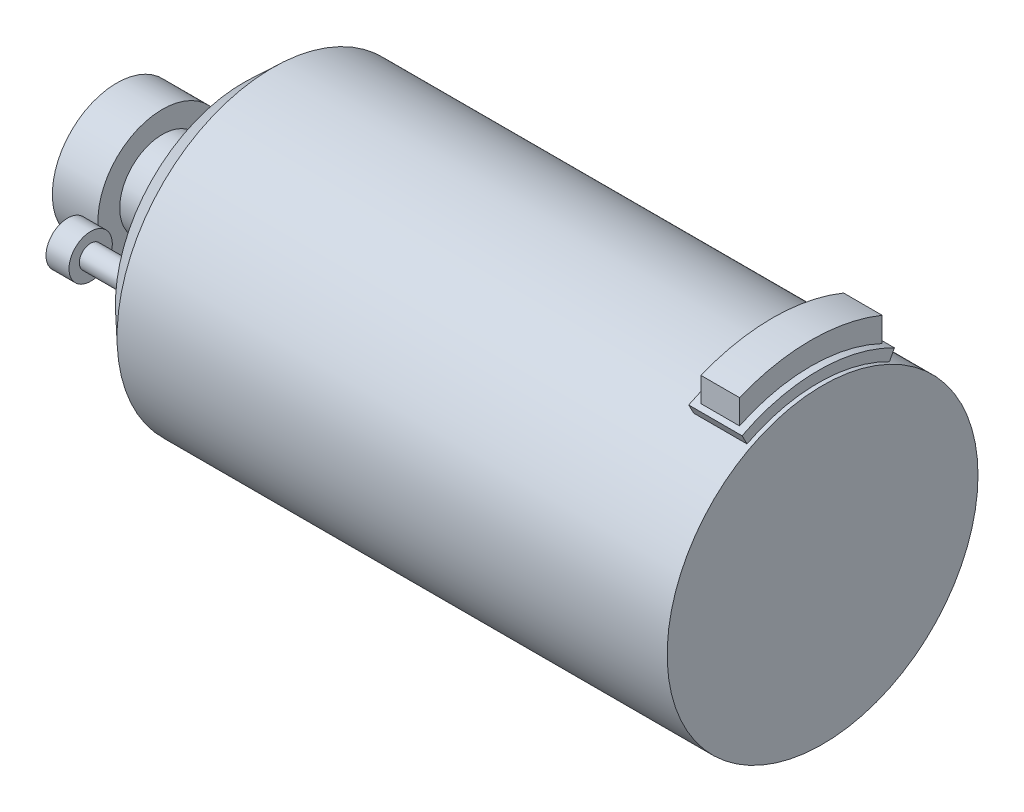
ISO-10303-21;
HEADER;
FILE_DESCRIPTION(('STEP AP214'),'2;1');
FILE_NAME('part.step','',(''),(''),'','','');
FILE_SCHEMA(('AUTOMOTIVE_DESIGN { 1 0 10303 214 1 1 1 1 }'));
ENDSEC;
DATA;
#1=APPLICATION_CONTEXT('core data for automotive mechanical design processes');
#2=APPLICATION_PROTOCOL_DEFINITION('international standard','automotive_design',2000,#1);
#3=PRODUCT_CONTEXT('',#1,'mechanical');
#4=PRODUCT('Part','Part','',(#3));
#5=PRODUCT_RELATED_PRODUCT_CATEGORY('part','',(#4));
#6=PRODUCT_DEFINITION_FORMATION('','',#4);
#7=PRODUCT_DEFINITION_CONTEXT('part definition',#1,'design');
#8=PRODUCT_DEFINITION('design','',#6,#7);
#9=PRODUCT_DEFINITION_SHAPE('','',#8);
#10=(LENGTH_UNIT() NAMED_UNIT(*) SI_UNIT(.MILLI.,.METRE.));
#11=(NAMED_UNIT(*) PLANE_ANGLE_UNIT() SI_UNIT($,.RADIAN.));
#12=(NAMED_UNIT(*) SI_UNIT($,.STERADIAN.) SOLID_ANGLE_UNIT());
#13=UNCERTAINTY_MEASURE_WITH_UNIT(LENGTH_MEASURE(1.E-05),#10,'distance_accuracy_value','');
#14=(GEOMETRIC_REPRESENTATION_CONTEXT(3) GLOBAL_UNCERTAINTY_ASSIGNED_CONTEXT((#13)) GLOBAL_UNIT_ASSIGNED_CONTEXT((#10,
#11,#12)) REPRESENTATION_CONTEXT('',''));
#15=CARTESIAN_POINT('',(0.,0.,0.));
#16=DIRECTION('',(0.,0.,1.));
#17=DIRECTION('',(1.,0.,0.));
#18=AXIS2_PLACEMENT_3D('',#15,#16,#17);
#19=CARTESIAN_POINT('',(94.6404,0.,0.));
#20=DIRECTION('',(1.,0.,0.));
#21=DIRECTION('',(0.,0.,-1.));
#22=AXIS2_PLACEMENT_3D('',#19,#20,#21);
#23=PLANE('',#22);
#24=CARTESIAN_POINT('',(94.6404,0.,0.));
#25=DIRECTION('',(1.,0.,0.));
#26=DIRECTION('',(0.,0.,-1.));
#27=AXIS2_PLACEMENT_3D('',#24,#25,#26);
#28=CIRCLE('',#27,19.9771);
#29=CARTESIAN_POINT('',(94.6404,0.,-19.9771));
#30=VERTEX_POINT('',#29);
#31=EDGE_CURVE('E185',#30,#30,#28,.T.);
#32=ORIENTED_EDGE('',*,*,#31,.T.);
#33=EDGE_LOOP('',(#32));
#34=FACE_BOUND('',#33,.T.);
#35=ADVANCED_FACE('F32',(#34),#23,.T.);
#36=CARTESIAN_POINT('',(94.6404,0.,0.));
#37=DIRECTION('',(1.,0.,0.));
#38=DIRECTION('',(0.,0.,-1.));
#39=AXIS2_PLACEMENT_3D('',#36,#37,#38);
#40=CYLINDRICAL_SURFACE('',#39,19.9771);
#41=CARTESIAN_POINT('',(94.0816,0.,0.));
#42=DIRECTION('',(1.,0.,0.));
#43=DIRECTION('',(0.,0.,-1.));
#44=AXIS2_PLACEMENT_3D('',#41,#42,#43);
#45=CIRCLE('',#44,19.9771);
#46=CARTESIAN_POINT('',(94.0816,17.7547439991048,9.15716058263971));
#47=VERTEX_POINT('',#46);
#48=CARTESIAN_POINT('',(94.0816,17.7547439991048,-9.15716058263971));
#49=VERTEX_POINT('',#48);
#50=EDGE_CURVE('E11',#47,#49,#45,.F.);
#51=ORIENTED_EDGE('',*,*,#50,.F.);
#52=DIRECTION('',(-1.,0.,0.));
#53=VECTOR('',#52,1.);
#54=CARTESIAN_POINT('',(94.0816,17.7547439991048,9.15716058263971));
#55=LINE('',#54,#53);
#56=CARTESIAN_POINT('',(87.2236,17.7547439991048,9.15716058263971));
#57=VERTEX_POINT('',#56);
#58=EDGE_CURVE('E140',#47,#57,#55,.T.);
#59=ORIENTED_EDGE('',*,*,#58,.T.);
#60=CARTESIAN_POINT('',(87.2236,0.,0.));
#61=DIRECTION('',(1.,0.,0.));
#62=DIRECTION('',(0.,0.,-1.));
#63=AXIS2_PLACEMENT_3D('',#60,#61,#62);
#64=CIRCLE('',#63,19.9771);
#65=CARTESIAN_POINT('',(87.2236,17.7547439991048,-9.15716058263971));
#66=VERTEX_POINT('',#65);
#67=EDGE_CURVE('E39',#57,#66,#64,.F.);
#68=ORIENTED_EDGE('',*,*,#67,.T.);
#69=DIRECTION('',(-1.,0.,0.));
#70=VECTOR('',#69,1.);
#71=CARTESIAN_POINT('',(94.0816,17.7547439991048,-9.15716058263971));
#72=LINE('',#71,#70);
#73=EDGE_CURVE('E153',#49,#66,#72,.T.);
#74=ORIENTED_EDGE('',*,*,#73,.F.);
#75=EDGE_LOOP('',(#51,#59,#68,#74));
#76=FACE_BOUND('',#75,.T.);
#77=ORIENTED_EDGE('',*,*,#31,.F.);
#78=EDGE_LOOP('',(#77));
#79=FACE_BOUND('',#78,.T.);
#80=CARTESIAN_POINT('',(23.9268,0.,0.));
#81=DIRECTION('',(1.,0.,0.));
#82=DIRECTION('',(0.,0.,-1.));
#83=AXIS2_PLACEMENT_3D('',#80,#81,#82);
#84=CIRCLE('',#83,19.9771);
#85=CARTESIAN_POINT('',(23.9268,0.,-19.9771));
#86=VERTEX_POINT('',#85);
#87=EDGE_CURVE('E182',#86,#86,#84,.T.);
#88=ORIENTED_EDGE('',*,*,#87,.T.);
#89=EDGE_LOOP('',(#88));
#90=FACE_BOUND('',#89,.T.);
#91=ADVANCED_FACE('F192',(#76,#79,#90),#40,.T.);
#92=CARTESIAN_POINT('',(23.9268,0.,0.));
#93=DIRECTION('',(1.,0.,0.));
#94=DIRECTION('',(0.,0.,-1.));
#95=AXIS2_PLACEMENT_3D('',#92,#93,#94);
#96=CONICAL_SURFACE('',#95,19.9771,0.756986000626544);
#97=CARTESIAN_POINT('',(20.1676,0.,0.));
#98=DIRECTION('',(1.,0.,0.));
#99=DIRECTION('',(0.,0.,-1.));
#100=AXIS2_PLACEMENT_3D('',#97,#98,#99);
#101=CIRCLE('',#100,16.4256668098212);
#102=CARTESIAN_POINT('',(20.1676,0.,-16.4256668098212));
#103=VERTEX_POINT('',#102);
#104=EDGE_CURVE('E179',#103,#103,#101,.T.);
#105=ORIENTED_EDGE('',*,*,#104,.T.);
#106=EDGE_LOOP('',(#105));
#107=FACE_BOUND('',#106,.T.);
#108=ORIENTED_EDGE('',*,*,#87,.F.);
#109=EDGE_LOOP('',(#108));
#110=FACE_BOUND('',#109,.T.);
#111=ADVANCED_FACE('F227',(#107,#110),#96,.T.);
#112=CARTESIAN_POINT('',(20.1676,16.4256668098212,0.));
#113=DIRECTION('',(-1.,0.,0.));
#114=DIRECTION('',(0.,0.,1.));
#115=AXIS2_PLACEMENT_3D('',#112,#113,#114);
#116=PLANE('',#115);
#117=CARTESIAN_POINT('',(20.1676,0.,12.7));
#118=DIRECTION('',(-1.,0.,0.));
#119=DIRECTION('',(0.,0.,1.));
#120=AXIS2_PLACEMENT_3D('',#117,#118,#119);
#121=CIRCLE('',#120,1.4605);
#122=CARTESIAN_POINT('',(20.1676,0.,14.1605));
#123=VERTEX_POINT('',#122);
#124=EDGE_CURVE('E438',#123,#123,#121,.T.);
#125=ORIENTED_EDGE('',*,*,#124,.F.);
#126=EDGE_LOOP('',(#125));
#127=FACE_BOUND('',#126,.T.);
#128=CARTESIAN_POINT('',(20.1676,0.,-12.7));
#129=DIRECTION('',(-1.,0.,0.));
#130=DIRECTION('',(0.,0.,1.));
#131=AXIS2_PLACEMENT_3D('',#128,#129,#130);
#132=CIRCLE('',#131,1.4605);
#133=CARTESIAN_POINT('',(20.1676,0.,-11.2395));
#134=VERTEX_POINT('',#133);
#135=EDGE_CURVE('E444',#134,#134,#132,.T.);
#136=ORIENTED_EDGE('',*,*,#135,.F.);
#137=EDGE_LOOP('',(#136));
#138=FACE_BOUND('',#137,.T.);
#139=CARTESIAN_POINT('',(20.1676,0.,0.));
#140=DIRECTION('',(1.,0.,0.));
#141=DIRECTION('',(0.,0.,-1.));
#142=AXIS2_PLACEMENT_3D('',#139,#140,#141);
#143=CIRCLE('',#142,2.5146);
#144=CARTESIAN_POINT('',(20.1676,0.,-2.5146));
#145=VERTEX_POINT('',#144);
#146=EDGE_CURVE('E176',#145,#145,#143,.T.);
#147=ORIENTED_EDGE('',*,*,#146,.T.);
#148=EDGE_LOOP('',(#147));
#149=FACE_BOUND('',#148,.T.);
#150=ORIENTED_EDGE('',*,*,#104,.F.);
#151=EDGE_LOOP('',(#150));
#152=FACE_BOUND('',#151,.T.);
#153=ADVANCED_FACE('F233',(#127,#138,#149,#152),#116,.T.);
#154=CARTESIAN_POINT('',(94.6404,0.,0.));
#155=DIRECTION('',(1.,0.,0.));
#156=DIRECTION('',(0.,0.,-1.));
#157=AXIS2_PLACEMENT_3D('',#154,#155,#156);
#158=CYLINDRICAL_SURFACE('',#157,2.5146);
#159=CARTESIAN_POINT('',(17.907,0.,0.));
#160=DIRECTION('',(1.,0.,0.));
#161=DIRECTION('',(0.,0.,-1.));
#162=AXIS2_PLACEMENT_3D('',#159,#160,#161);
#163=CIRCLE('',#162,2.5146);
#164=CARTESIAN_POINT('',(17.907,0.,-2.5146));
#165=VERTEX_POINT('',#164);
#166=EDGE_CURVE('E173',#165,#165,#163,.T.);
#167=ORIENTED_EDGE('',*,*,#166,.T.);
#168=EDGE_LOOP('',(#167));
#169=FACE_BOUND('',#168,.T.);
#170=ORIENTED_EDGE('',*,*,#146,.F.);
#171=EDGE_LOOP('',(#170));
#172=FACE_BOUND('',#171,.T.);
#173=ADVANCED_FACE('F239',(#169,#172),#158,.T.);
#174=CARTESIAN_POINT('',(17.907,2.5146,0.));
#175=DIRECTION('',(1.,0.,0.));
#176=DIRECTION('',(0.,0.,-1.));
#177=AXIS2_PLACEMENT_3D('',#174,#175,#176);
#178=PLANE('',#177);
#179=CARTESIAN_POINT('',(17.907,0.,0.));
#180=DIRECTION('',(1.,0.,0.));
#181=DIRECTION('',(0.,0.,-1.));
#182=AXIS2_PLACEMENT_3D('',#179,#180,#181);
#183=CIRCLE('',#182,5.4864);
#184=CARTESIAN_POINT('',(17.907,0.,-5.4864));
#185=VERTEX_POINT('',#184);
#186=EDGE_CURVE('E170',#185,#185,#183,.T.);
#187=ORIENTED_EDGE('',*,*,#186,.T.);
#188=EDGE_LOOP('',(#187));
#189=FACE_BOUND('',#188,.T.);
#190=ORIENTED_EDGE('',*,*,#166,.F.);
#191=EDGE_LOOP('',(#190));
#192=FACE_BOUND('',#191,.T.);
#193=ADVANCED_FACE('F245',(#189,#192),#178,.T.);
#194=CARTESIAN_POINT('',(94.6404,0.,0.));
#195=DIRECTION('',(1.,0.,0.));
#196=DIRECTION('',(0.,0.,-1.));
#197=AXIS2_PLACEMENT_3D('',#194,#195,#196);
#198=CYLINDRICAL_SURFACE('',#197,5.4864);
#199=CARTESIAN_POINT('',(9.779,0.,0.));
#200=DIRECTION('',(1.,0.,0.));
#201=DIRECTION('',(0.,0.,-1.));
#202=AXIS2_PLACEMENT_3D('',#199,#200,#201);
#203=CIRCLE('',#202,5.4864);
#204=CARTESIAN_POINT('',(9.779,0.,-5.4864));
#205=VERTEX_POINT('',#204);
#206=EDGE_CURVE('E167',#205,#205,#203,.T.);
#207=ORIENTED_EDGE('',*,*,#206,.T.);
#208=EDGE_LOOP('',(#207));
#209=FACE_BOUND('',#208,.T.);
#210=ORIENTED_EDGE('',*,*,#186,.F.);
#211=EDGE_LOOP('',(#210));
#212=FACE_BOUND('',#211,.T.);
#213=ADVANCED_FACE('F249',(#209,#212),#198,.T.);
#214=CARTESIAN_POINT('',(9.779,5.4864,0.));
#215=DIRECTION('',(1.,0.,0.));
#216=DIRECTION('',(0.,0.,-1.));
#217=AXIS2_PLACEMENT_3D('',#214,#215,#216);
#218=PLANE('',#217);
#219=CARTESIAN_POINT('',(9.779,0.,0.));
#220=DIRECTION('',(1.,0.,0.));
#221=DIRECTION('',(0.,0.,-1.));
#222=AXIS2_PLACEMENT_3D('',#219,#220,#221);
#223=CIRCLE('',#222,8.2804);
#224=CARTESIAN_POINT('',(9.779,0.,-8.2804));
#225=VERTEX_POINT('',#224);
#226=EDGE_CURVE('E164',#225,#225,#223,.T.);
#227=ORIENTED_EDGE('',*,*,#226,.T.);
#228=EDGE_LOOP('',(#227));
#229=FACE_BOUND('',#228,.T.);
#230=ORIENTED_EDGE('',*,*,#206,.F.);
#231=EDGE_LOOP('',(#230));
#232=FACE_BOUND('',#231,.T.);
#233=ADVANCED_FACE('F253',(#229,#232),#218,.T.);
#234=CARTESIAN_POINT('',(94.6404,0.,0.));
#235=DIRECTION('',(1.,0.,0.));
#236=DIRECTION('',(0.,0.,-1.));
#237=AXIS2_PLACEMENT_3D('',#234,#235,#236);
#238=CYLINDRICAL_SURFACE('',#237,8.2804);
#239=CARTESIAN_POINT('',(3.9116,0.,0.));
#240=DIRECTION('',(1.,0.,0.));
#241=DIRECTION('',(0.,0.,-1.));
#242=AXIS2_PLACEMENT_3D('',#239,#240,#241);
#243=CIRCLE('',#242,8.2804);
#244=CARTESIAN_POINT('',(3.9116,0.,-8.2804));
#245=VERTEX_POINT('',#244);
#246=EDGE_CURVE('E161',#245,#245,#243,.T.);
#247=ORIENTED_EDGE('',*,*,#246,.T.);
#248=EDGE_LOOP('',(#247));
#249=FACE_BOUND('',#248,.T.);
#250=ORIENTED_EDGE('',*,*,#226,.F.);
#251=EDGE_LOOP('',(#250));
#252=FACE_BOUND('',#251,.T.);
#253=ADVANCED_FACE('F257',(#249,#252),#238,.T.);
#254=CARTESIAN_POINT('',(3.9116,8.2804,0.));
#255=DIRECTION('',(-1.,0.,0.));
#256=DIRECTION('',(0.,0.,1.));
#257=AXIS2_PLACEMENT_3D('',#254,#255,#256);
#258=PLANE('',#257);
#259=CARTESIAN_POINT('',(3.9116,0.,0.));
#260=DIRECTION('',(1.,0.,0.));
#261=DIRECTION('',(0.,0.,-1.));
#262=AXIS2_PLACEMENT_3D('',#259,#260,#261);
#263=CIRCLE('',#262,2.5146);
#264=CARTESIAN_POINT('',(3.9116,0.,-2.5146));
#265=VERTEX_POINT('',#264);
#266=EDGE_CURVE('E158',#265,#265,#263,.T.);
#267=ORIENTED_EDGE('',*,*,#266,.T.);
#268=EDGE_LOOP('',(#267));
#269=FACE_BOUND('',#268,.T.);
#270=ORIENTED_EDGE('',*,*,#246,.F.);
#271=EDGE_LOOP('',(#270));
#272=FACE_BOUND('',#271,.T.);
#273=ADVANCED_FACE('F261',(#269,#272),#258,.T.);
#274=CARTESIAN_POINT('',(94.6404,0.,0.));
#275=DIRECTION('',(1.,0.,0.));
#276=DIRECTION('',(0.,0.,-1.));
#277=AXIS2_PLACEMENT_3D('',#274,#275,#276);
#278=CYLINDRICAL_SURFACE('',#277,2.5146);
#279=CARTESIAN_POINT('',(0.,0.,0.));
#280=DIRECTION('',(1.,0.,0.));
#281=DIRECTION('',(0.,0.,-1.));
#282=AXIS2_PLACEMENT_3D('',#279,#280,#281);
#283=CIRCLE('',#282,2.5146);
#284=CARTESIAN_POINT('',(0.,0.,-2.5146));
#285=VERTEX_POINT('',#284);
#286=EDGE_CURVE('E155',#285,#285,#283,.T.);
#287=ORIENTED_EDGE('',*,*,#286,.T.);
#288=EDGE_LOOP('',(#287));
#289=FACE_BOUND('',#288,.T.);
#290=ORIENTED_EDGE('',*,*,#266,.F.);
#291=EDGE_LOOP('',(#290));
#292=FACE_BOUND('',#291,.T.);
#293=ADVANCED_FACE('F265',(#289,#292),#278,.T.);
#294=CARTESIAN_POINT('',(0.,2.5146,0.));
#295=DIRECTION('',(-1.,0.,0.));
#296=DIRECTION('',(0.,0.,1.));
#297=AXIS2_PLACEMENT_3D('',#294,#295,#296);
#298=PLANE('',#297);
#299=ORIENTED_EDGE('',*,*,#286,.F.);
#300=EDGE_LOOP('',(#299));
#301=FACE_BOUND('',#300,.T.);
#302=ADVANCED_FACE('F269',(#301),#298,.T.);
#303=CARTESIAN_POINT('',(94.0816,18.985047302285,-9.7917));
#304=DIRECTION('',(0.,0.458382877526754,0.888754824228984));
#305=DIRECTION('',(0.,-0.888754824228984,0.458382877526754));
#306=AXIS2_PLACEMENT_3D('',#303,#304,#305);
#307=PLANE('',#306);
#308=ORIENTED_EDGE('',*,*,#73,.T.);
#309=DIRECTION('',(0.,0.888754824228984,-0.458382877526754));
#310=VECTOR('',#309,1.);
#311=CARTESIAN_POINT('',(87.2236,18.985047302285,-9.7917));
#312=LINE('',#311,#310);
#313=CARTESIAN_POINT('',(87.2236,18.985047302285,-9.7917));
#314=VERTEX_POINT('',#313);
#315=EDGE_CURVE('E132',#66,#314,#312,.T.);
#316=ORIENTED_EDGE('',*,*,#315,.T.);
#317=DIRECTION('',(-1.,0.,0.));
#318=VECTOR('',#317,1.);
#319=CARTESIAN_POINT('',(94.0816,18.985047302285,-9.7917));
#320=LINE('',#319,#318);
#321=CARTESIAN_POINT('',(94.0816,18.985047302285,-9.7917));
#322=VERTEX_POINT('',#321);
#323=EDGE_CURVE('E151',#322,#314,#320,.T.);
#324=ORIENTED_EDGE('',*,*,#323,.F.);
#325=DIRECTION('',(0.,0.888754824228984,-0.458382877526754));
#326=VECTOR('',#325,1.);
#327=CARTESIAN_POINT('',(94.0816,18.985047302285,-9.7917));
#328=LINE('',#327,#326);
#329=EDGE_CURVE('E133',#49,#322,#328,.T.);
#330=ORIENTED_EDGE('',*,*,#329,.F.);
#331=EDGE_LOOP('',(#308,#316,#324,#330));
#332=FACE_BOUND('',#331,.T.);
#333=ADVANCED_FACE('F210',(#332),#307,.F.);
#334=CARTESIAN_POINT('',(94.0816,0.,0.));
#335=DIRECTION('',(-1.,0.,0.));
#336=DIRECTION('',(0.,0.,1.));
#337=AXIS2_PLACEMENT_3D('',#334,#335,#336);
#338=CYLINDRICAL_SURFACE('',#337,21.3614);
#339=DIRECTION('',(-1.,0.,0.));
#340=VECTOR('',#339,1.);
#341=CARTESIAN_POINT('',(93.1291,19.2933022989845,-9.16939999999998));
#342=LINE('',#341,#340);
#343=CARTESIAN_POINT('',(93.1291,19.2933022989845,-9.16939999999998));
#344=VERTEX_POINT('',#343);
#345=CARTESIAN_POINT('',(88.1761,19.2933022989845,-9.16939999999998));
#346=VERTEX_POINT('',#345);
#347=EDGE_CURVE('E46',#344,#346,#342,.T.);
#348=ORIENTED_EDGE('',*,*,#347,.F.);
#349=CARTESIAN_POINT('',(93.1291,0.,0.));
#350=DIRECTION('',(1.,0.,0.));
#351=DIRECTION('',(0.,0.,-1.));
#352=AXIS2_PLACEMENT_3D('',#349,#350,#351);
#353=CIRCLE('',#352,21.3614);
#354=CARTESIAN_POINT('',(93.1291,19.2933022989845,9.16940000000001));
#355=VERTEX_POINT('',#354);
#356=EDGE_CURVE('E50',#344,#355,#353,.T.);
#357=ORIENTED_EDGE('',*,*,#356,.T.);
#358=DIRECTION('',(-1.,0.,0.));
#359=VECTOR('',#358,1.);
#360=CARTESIAN_POINT('',(93.1291,19.2933022989845,9.16940000000002));
#361=LINE('',#360,#359);
#362=CARTESIAN_POINT('',(88.1761,19.2933022989845,9.16940000000002));
#363=VERTEX_POINT('',#362);
#364=EDGE_CURVE('E115',#355,#363,#361,.T.);
#365=ORIENTED_EDGE('',*,*,#364,.T.);
#366=CARTESIAN_POINT('',(88.1761,0.,0.));
#367=DIRECTION('',(1.,0.,0.));
#368=DIRECTION('',(0.,0.,-1.));
#369=AXIS2_PLACEMENT_3D('',#366,#367,#368);
#370=CIRCLE('',#369,21.3614);
#371=EDGE_CURVE('E128',#346,#363,#370,.T.);
#372=ORIENTED_EDGE('',*,*,#371,.F.);
#373=EDGE_LOOP('',(#348,#357,#365,#372));
#374=FACE_BOUND('',#373,.T.);
#375=ORIENTED_EDGE('',*,*,#323,.T.);
#376=CARTESIAN_POINT('',(87.2236,0.,0.));
#377=DIRECTION('',(1.,0.,0.));
#378=DIRECTION('',(0.,0.,-1.));
#379=AXIS2_PLACEMENT_3D('',#376,#377,#378);
#380=CIRCLE('',#379,21.3614);
#381=CARTESIAN_POINT('',(87.2236,18.985047302285,9.7917));
#382=VERTEX_POINT('',#381);
#383=EDGE_CURVE('E143',#314,#382,#380,.T.);
#384=ORIENTED_EDGE('',*,*,#383,.T.);
#385=DIRECTION('',(-1.,0.,0.));
#386=VECTOR('',#385,1.);
#387=CARTESIAN_POINT('',(94.0816,18.985047302285,9.7917));
#388=LINE('',#387,#386);
#389=CARTESIAN_POINT('',(94.0816,18.985047302285,9.7917));
#390=VERTEX_POINT('',#389);
#391=EDGE_CURVE('E149',#390,#382,#388,.T.);
#392=ORIENTED_EDGE('',*,*,#391,.F.);
#393=CARTESIAN_POINT('',(94.0816,0.,0.));
#394=DIRECTION('',(1.,0.,0.));
#395=DIRECTION('',(0.,0.,-1.));
#396=AXIS2_PLACEMENT_3D('',#393,#394,#395);
#397=CIRCLE('',#396,21.3614);
#398=EDGE_CURVE('E135',#322,#390,#397,.T.);
#399=ORIENTED_EDGE('',*,*,#398,.F.);
#400=EDGE_LOOP('',(#375,#384,#392,#399));
#401=FACE_BOUND('',#400,.T.);
#402=ADVANCED_FACE('F206',(#374,#401),#338,.T.);
#403=CARTESIAN_POINT('',(94.0816,18.985047302285,9.7917));
#404=DIRECTION('',(0.,0.458382877526754,-0.888754824228984));
#405=DIRECTION('',(0.,0.888754824228984,0.458382877526754));
#406=AXIS2_PLACEMENT_3D('',#403,#404,#405);
#407=PLANE('',#406);
#408=ORIENTED_EDGE('',*,*,#391,.T.);
#409=DIRECTION('',(0.,-0.888754824228984,-0.458382877526754));
#410=VECTOR('',#409,1.);
#411=CARTESIAN_POINT('',(87.2236,18.985047302285,9.7917));
#412=LINE('',#411,#410);
#413=EDGE_CURVE('E136',#382,#57,#412,.T.);
#414=ORIENTED_EDGE('',*,*,#413,.T.);
#415=ORIENTED_EDGE('',*,*,#58,.F.);
#416=DIRECTION('',(0.,-0.888754824228984,-0.458382877526754));
#417=VECTOR('',#416,1.);
#418=CARTESIAN_POINT('',(94.0816,18.985047302285,9.7917));
#419=LINE('',#418,#417);
#420=EDGE_CURVE('E138',#390,#47,#419,.T.);
#421=ORIENTED_EDGE('',*,*,#420,.F.);
#422=EDGE_LOOP('',(#408,#414,#415,#421));
#423=FACE_BOUND('',#422,.T.);
#424=ADVANCED_FACE('F201',(#423),#407,.F.);
#425=CARTESIAN_POINT('',(94.0816,0.,0.));
#426=DIRECTION('',(1.,0.,0.));
#427=DIRECTION('',(0.,0.,-1.));
#428=AXIS2_PLACEMENT_3D('',#425,#426,#427);
#429=PLANE('',#428);
#430=ORIENTED_EDGE('',*,*,#420,.T.);
#431=ORIENTED_EDGE('',*,*,#50,.T.);
#432=ORIENTED_EDGE('',*,*,#329,.T.);
#433=ORIENTED_EDGE('',*,*,#398,.T.);
#434=EDGE_LOOP('',(#430,#431,#432,#433));
#435=FACE_BOUND('',#434,.T.);
#436=ADVANCED_FACE('F212',(#435),#429,.T.);
#437=CARTESIAN_POINT('',(87.2236,0.,0.));
#438=DIRECTION('',(1.,0.,0.));
#439=DIRECTION('',(0.,0.,-1.));
#440=AXIS2_PLACEMENT_3D('',#437,#438,#439);
#441=PLANE('',#440);
#442=ORIENTED_EDGE('',*,*,#67,.F.);
#443=ORIENTED_EDGE('',*,*,#413,.F.);
#444=ORIENTED_EDGE('',*,*,#383,.F.);
#445=ORIENTED_EDGE('',*,*,#315,.F.);
#446=EDGE_LOOP('',(#442,#443,#444,#445));
#447=FACE_BOUND('',#446,.T.);
#448=ADVANCED_FACE('F198',(#447),#441,.F.);
#449=CARTESIAN_POINT('',(93.1291,0.,0.));
#450=DIRECTION('',(1.,0.,0.));
#451=DIRECTION('',(0.,0.,-1.));
#452=AXIS2_PLACEMENT_3D('',#449,#450,#451);
#453=PLANE('',#452);
#454=ORIENTED_EDGE('',*,*,#356,.F.);
#455=DIRECTION('',(0.,1.,0.));
#456=VECTOR('',#455,1.);
#457=CARTESIAN_POINT('',(93.1291,19.2933022989845,-9.16939999999998));
#458=LINE('',#457,#456);
#459=CARTESIAN_POINT('',(93.1291,22.4429022989845,-9.16939999999998));
#460=VERTEX_POINT('',#459);
#461=EDGE_CURVE('E92',#344,#460,#458,.T.);
#462=ORIENTED_EDGE('',*,*,#461,.T.);
#463=CARTESIAN_POINT('',(93.1291,0.,0.));
#464=DIRECTION('',(1.,0.,0.));
#465=DIRECTION('',(0.,0.,1.));
#466=AXIS2_PLACEMENT_3D('',#463,#464,#465);
#467=CIRCLE('',#466,24.2437983814782);
#468=CARTESIAN_POINT('',(93.1291,22.4429022989845,9.16940000000002));
#469=VERTEX_POINT('',#468);
#470=EDGE_CURVE('E96',#460,#469,#467,.T.);
#471=ORIENTED_EDGE('',*,*,#470,.T.);
#472=DIRECTION('',(0.,-1.,0.));
#473=VECTOR('',#472,1.);
#474=CARTESIAN_POINT('',(93.1291,19.2933022989845,9.16940000000002));
#475=LINE('',#474,#473);
#476=EDGE_CURVE('E113',#469,#355,#475,.T.);
#477=ORIENTED_EDGE('',*,*,#476,.T.);
#478=EDGE_LOOP('',(#454,#462,#471,#477));
#479=FACE_BOUND('',#478,.T.);
#480=ADVANCED_FACE('F94',(#479),#453,.T.);
#481=CARTESIAN_POINT('',(88.1761,0.,0.));
#482=DIRECTION('',(1.,0.,0.));
#483=DIRECTION('',(0.,0.,-1.));
#484=AXIS2_PLACEMENT_3D('',#481,#482,#483);
#485=PLANE('',#484);
#486=DIRECTION('',(0.,1.,0.));
#487=VECTOR('',#486,1.);
#488=CARTESIAN_POINT('',(88.1761,19.2933022989845,-9.16939999999998));
#489=LINE('',#488,#487);
#490=CARTESIAN_POINT('',(88.1761,22.4429022989845,-9.16939999999998));
#491=VERTEX_POINT('',#490);
#492=EDGE_CURVE('E105',#346,#491,#489,.T.);
#493=ORIENTED_EDGE('',*,*,#492,.F.);
#494=ORIENTED_EDGE('',*,*,#371,.T.);
#495=DIRECTION('',(0.,-1.,0.));
#496=VECTOR('',#495,1.);
#497=CARTESIAN_POINT('',(88.1761,19.2933022989845,9.16940000000002));
#498=LINE('',#497,#496);
#499=CARTESIAN_POINT('',(88.1761,22.4429022989845,9.16940000000002));
#500=VERTEX_POINT('',#499);
#501=EDGE_CURVE('E99',#500,#363,#498,.T.);
#502=ORIENTED_EDGE('',*,*,#501,.F.);
#503=CARTESIAN_POINT('',(88.1761,0.,0.));
#504=DIRECTION('',(1.,0.,0.));
#505=DIRECTION('',(0.,0.,1.));
#506=AXIS2_PLACEMENT_3D('',#503,#504,#505);
#507=CIRCLE('',#506,24.2437983814782);
#508=EDGE_CURVE('E120',#491,#500,#507,.T.);
#509=ORIENTED_EDGE('',*,*,#508,.F.);
#510=EDGE_LOOP('',(#493,#494,#502,#509));
#511=FACE_BOUND('',#510,.T.);
#512=ADVANCED_FACE('F295',(#511),#485,.F.);
#513=CARTESIAN_POINT('',(93.1291,19.2933022989845,-9.16939999999998));
#514=DIRECTION('',(0.,0.,1.));
#515=DIRECTION('',(1.,0.,0.));
#516=AXIS2_PLACEMENT_3D('',#513,#514,#515);
#517=PLANE('',#516);
#518=ORIENTED_EDGE('',*,*,#492,.T.);
#519=DIRECTION('',(-1.,0.,0.));
#520=VECTOR('',#519,1.);
#521=CARTESIAN_POINT('',(93.1291,22.4429022989845,-9.16939999999998));
#522=LINE('',#521,#520);
#523=EDGE_CURVE('E102',#460,#491,#522,.T.);
#524=ORIENTED_EDGE('',*,*,#523,.F.);
#525=ORIENTED_EDGE('',*,*,#461,.F.);
#526=ORIENTED_EDGE('',*,*,#347,.T.);
#527=EDGE_LOOP('',(#518,#524,#525,#526));
#528=FACE_BOUND('',#527,.T.);
#529=ADVANCED_FACE('F103',(#528),#517,.F.);
#530=CARTESIAN_POINT('',(93.1291,0.,0.));
#531=DIRECTION('',(-1.,0.,0.));
#532=DIRECTION('',(0.,0.,1.));
#533=AXIS2_PLACEMENT_3D('',#530,#531,#532);
#534=CYLINDRICAL_SURFACE('',#533,24.2437983814782);
#535=ORIENTED_EDGE('',*,*,#508,.T.);
#536=DIRECTION('',(-1.,0.,0.));
#537=VECTOR('',#536,1.);
#538=CARTESIAN_POINT('',(93.1291,22.4429022989845,9.16940000000002));
#539=LINE('',#538,#537);
#540=EDGE_CURVE('E108',#469,#500,#539,.T.);
#541=ORIENTED_EDGE('',*,*,#540,.F.);
#542=ORIENTED_EDGE('',*,*,#470,.F.);
#543=ORIENTED_EDGE('',*,*,#523,.T.);
#544=EDGE_LOOP('',(#535,#541,#542,#543));
#545=FACE_BOUND('',#544,.T.);
#546=ADVANCED_FACE('F110',(#545),#534,.T.);
#547=CARTESIAN_POINT('',(93.1291,19.2933022989845,9.16940000000002));
#548=DIRECTION('',(0.,0.,-1.));
#549=DIRECTION('',(-1.,0.,0.));
#550=AXIS2_PLACEMENT_3D('',#547,#548,#549);
#551=PLANE('',#550);
#552=ORIENTED_EDGE('',*,*,#501,.T.);
#553=ORIENTED_EDGE('',*,*,#364,.F.);
#554=ORIENTED_EDGE('',*,*,#476,.F.);
#555=ORIENTED_EDGE('',*,*,#540,.T.);
#556=EDGE_LOOP('',(#552,#553,#554,#555));
#557=FACE_BOUND('',#556,.T.);
#558=ADVANCED_FACE('F321',(#557),#551,.F.);
#559=CARTESIAN_POINT('',(13.2588,0.,-12.7));
#560=DIRECTION('',(1.,0.,0.));
#561=DIRECTION('',(0.,0.,-1.));
#562=AXIS2_PLACEMENT_3D('',#559,#560,#561);
#563=CYLINDRICAL_SURFACE('',#562,1.4605);
#564=CARTESIAN_POINT('',(13.2588,0.,-12.7));
#565=DIRECTION('',(-1.,0.,0.));
#566=DIRECTION('',(0.,0.,1.));
#567=AXIS2_PLACEMENT_3D('',#564,#565,#566);
#568=CIRCLE('',#567,1.4605);
#569=CARTESIAN_POINT('',(13.2588,0.,-11.2395));
#570=VERTEX_POINT('',#569);
#571=EDGE_CURVE('E121',#570,#570,#568,.T.);
#572=ORIENTED_EDGE('',*,*,#571,.F.);
#573=EDGE_LOOP('',(#572));
#574=FACE_BOUND('',#573,.T.);
#575=ORIENTED_EDGE('',*,*,#135,.T.);
#576=EDGE_LOOP('',(#575));
#577=FACE_BOUND('',#576,.T.);
#578=ADVANCED_FACE('F330',(#574,#577),#563,.T.);
#579=CARTESIAN_POINT('',(13.2588,0.,12.7));
#580=DIRECTION('',(1.,0.,0.));
#581=DIRECTION('',(0.,0.,-1.));
#582=AXIS2_PLACEMENT_3D('',#579,#580,#581);
#583=CYLINDRICAL_SURFACE('',#582,1.4605);
#584=CARTESIAN_POINT('',(13.2588,0.,12.7));
#585=DIRECTION('',(-1.,0.,0.));
#586=DIRECTION('',(0.,0.,1.));
#587=AXIS2_PLACEMENT_3D('',#584,#585,#586);
#588=CIRCLE('',#587,1.4605);
#589=CARTESIAN_POINT('',(13.2588,0.,14.1605));
#590=VERTEX_POINT('',#589);
#591=EDGE_CURVE('E441',#590,#590,#588,.T.);
#592=ORIENTED_EDGE('',*,*,#591,.F.);
#593=EDGE_LOOP('',(#592));
#594=FACE_BOUND('',#593,.T.);
#595=ORIENTED_EDGE('',*,*,#124,.T.);
#596=EDGE_LOOP('',(#595));
#597=FACE_BOUND('',#596,.T.);
#598=ADVANCED_FACE('F348',(#594,#597),#583,.T.);
#599=CARTESIAN_POINT('',(10.2997,0.,12.7));
#600=DIRECTION('',(1.,0.,0.));
#601=DIRECTION('',(0.,0.,-1.));
#602=AXIS2_PLACEMENT_3D('',#599,#600,#601);
#603=CYLINDRICAL_SURFACE('',#602,2.7813);
#604=CARTESIAN_POINT('',(10.2997,0.,12.7));
#605=DIRECTION('',(-1.,0.,0.));
#606=DIRECTION('',(0.,0.,1.));
#607=AXIS2_PLACEMENT_3D('',#604,#605,#606);
#608=CIRCLE('',#607,2.7813);
#609=CARTESIAN_POINT('',(10.2997,0.,15.4813));
#610=VERTEX_POINT('',#609);
#611=EDGE_CURVE('E435',#610,#610,#608,.T.);
#612=ORIENTED_EDGE('',*,*,#611,.F.);
#613=EDGE_LOOP('',(#612));
#614=FACE_BOUND('',#613,.T.);
#615=CARTESIAN_POINT('',(13.2588,0.,12.7));
#616=DIRECTION('',(-1.,0.,0.));
#617=DIRECTION('',(0.,0.,1.));
#618=AXIS2_PLACEMENT_3D('',#615,#616,#617);
#619=CIRCLE('',#618,2.7813);
#620=CARTESIAN_POINT('',(13.2588,0.,15.4813));
#621=VERTEX_POINT('',#620);
#622=EDGE_CURVE('E432',#621,#621,#619,.T.);
#623=ORIENTED_EDGE('',*,*,#622,.T.);
#624=EDGE_LOOP('',(#623));
#625=FACE_BOUND('',#624,.T.);
#626=ADVANCED_FACE('F358',(#614,#625),#603,.T.);
#627=CARTESIAN_POINT('',(10.2997,0.,12.7));
#628=DIRECTION('',(-1.,0.,0.));
#629=DIRECTION('',(0.,0.,1.));
#630=AXIS2_PLACEMENT_3D('',#627,#628,#629);
#631=PLANE('',#630);
#632=ORIENTED_EDGE('',*,*,#611,.T.);
#633=EDGE_LOOP('',(#632));
#634=FACE_BOUND('',#633,.T.);
#635=ADVANCED_FACE('F368',(#634),#631,.T.);
#636=CARTESIAN_POINT('',(13.2588,0.,12.7));
#637=DIRECTION('',(-1.,0.,0.));
#638=DIRECTION('',(0.,0.,1.));
#639=AXIS2_PLACEMENT_3D('',#636,#637,#638);
#640=PLANE('',#639);
#641=ORIENTED_EDGE('',*,*,#591,.T.);
#642=EDGE_LOOP('',(#641));
#643=FACE_BOUND('',#642,.T.);
#644=ORIENTED_EDGE('',*,*,#622,.F.);
#645=EDGE_LOOP('',(#644));
#646=FACE_BOUND('',#645,.T.);
#647=ADVANCED_FACE('F378',(#643,#646),#640,.F.);
#648=CARTESIAN_POINT('',(10.2997,0.,-12.7));
#649=DIRECTION('',(1.,0.,0.));
#650=DIRECTION('',(0.,0.,-1.));
#651=AXIS2_PLACEMENT_3D('',#648,#649,#650);
#652=CYLINDRICAL_SURFACE('',#651,2.7813);
#653=CARTESIAN_POINT('',(10.2997,0.,-12.7));
#654=DIRECTION('',(-1.,0.,0.));
#655=DIRECTION('',(0.,0.,1.));
#656=AXIS2_PLACEMENT_3D('',#653,#654,#655);
#657=CIRCLE('',#656,2.7813);
#658=CARTESIAN_POINT('',(10.2997,0.,-9.9187));
#659=VERTEX_POINT('',#658);
#660=EDGE_CURVE('E429',#659,#659,#657,.T.);
#661=ORIENTED_EDGE('',*,*,#660,.F.);
#662=EDGE_LOOP('',(#661));
#663=FACE_BOUND('',#662,.T.);
#664=CARTESIAN_POINT('',(13.2588,0.,-12.7));
#665=DIRECTION('',(-1.,0.,0.));
#666=DIRECTION('',(0.,0.,1.));
#667=AXIS2_PLACEMENT_3D('',#664,#665,#666);
#668=CIRCLE('',#667,2.7813);
#669=CARTESIAN_POINT('',(13.2588,0.,-9.9187));
#670=VERTEX_POINT('',#669);
#671=EDGE_CURVE('E427',#670,#670,#668,.T.);
#672=ORIENTED_EDGE('',*,*,#671,.T.);
#673=EDGE_LOOP('',(#672));
#674=FACE_BOUND('',#673,.T.);
#675=ADVANCED_FACE('F388',(#663,#674),#652,.T.);
#676=CARTESIAN_POINT('',(10.2997,0.,-12.7));
#677=DIRECTION('',(-1.,0.,0.));
#678=DIRECTION('',(0.,0.,1.));
#679=AXIS2_PLACEMENT_3D('',#676,#677,#678);
#680=PLANE('',#679);
#681=ORIENTED_EDGE('',*,*,#660,.T.);
#682=EDGE_LOOP('',(#681));
#683=FACE_BOUND('',#682,.T.);
#684=ADVANCED_FACE('F398',(#683),#680,.T.);
#685=CARTESIAN_POINT('',(13.2588,0.,-12.7));
#686=DIRECTION('',(-1.,0.,0.));
#687=DIRECTION('',(0.,0.,1.));
#688=AXIS2_PLACEMENT_3D('',#685,#686,#687);
#689=PLANE('',#688);
#690=ORIENTED_EDGE('',*,*,#571,.T.);
#691=EDGE_LOOP('',(#690));
#692=FACE_BOUND('',#691,.T.);
#693=ORIENTED_EDGE('',*,*,#671,.F.);
#694=EDGE_LOOP('',(#693));
#695=FACE_BOUND('',#694,.T.);
#696=ADVANCED_FACE('F408',(#692,#695),#689,.F.);
#697=CLOSED_SHELL('',(#35,#91,#111,#153,#173,#193,#213,#233,#253,#273,#293,#302,#333,#402,#424,
#436,#448,#480,#512,#529,#546,#558,#578,#598,#626,#635,#647,#675,#684,#696));
#698=MANIFOLD_SOLID_BREP('B2',#697);
#699=ADVANCED_BREP_SHAPE_REPRESENTATION('',(#18,#698),#14);
#700=SHAPE_DEFINITION_REPRESENTATION(#9,#699);
ENDSEC;
END-ISO-10303-21;
